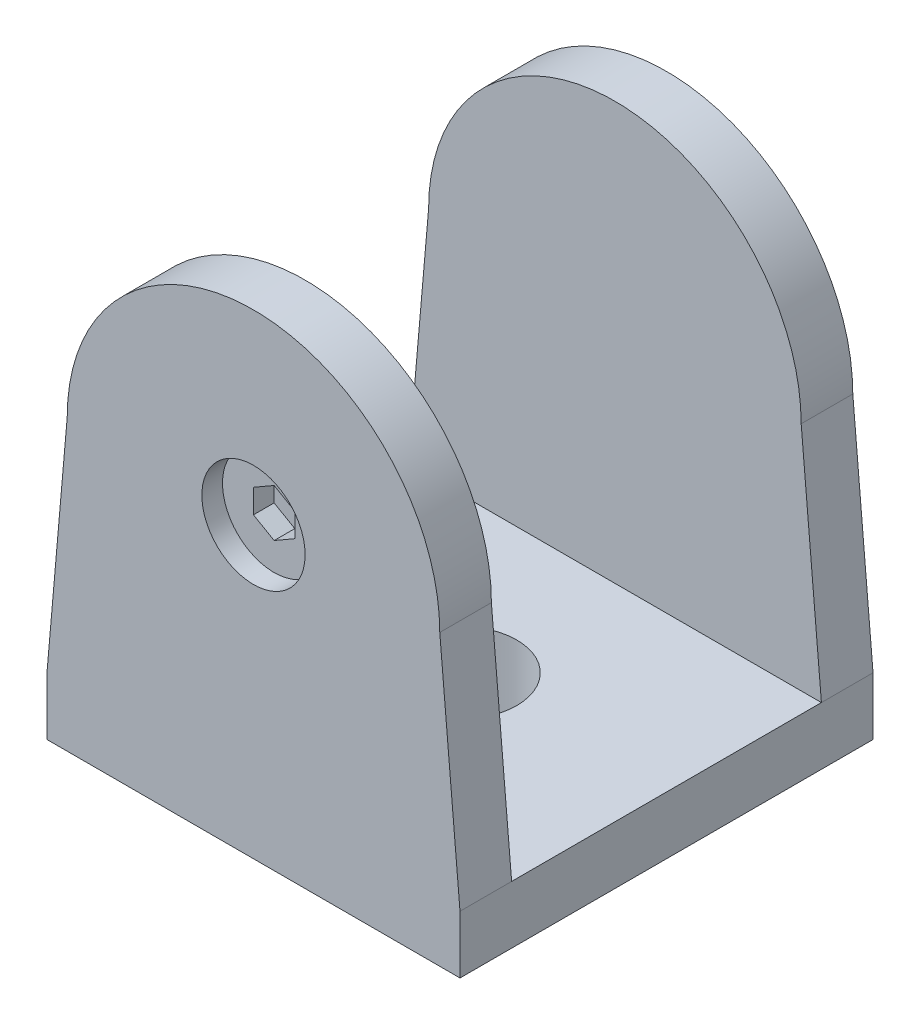
ISO-10303-21;
HEADER;
FILE_DESCRIPTION(('STEP AP214'),'2;1');
FILE_NAME('part.step','',(''),(''),'','','');
FILE_SCHEMA(('AUTOMOTIVE_DESIGN { 1 0 10303 214 1 1 1 1 }'));
ENDSEC;
DATA;
#1=APPLICATION_CONTEXT('core data for automotive mechanical design processes');
#2=APPLICATION_PROTOCOL_DEFINITION('international standard','automotive_design',2000,#1);
#3=PRODUCT_CONTEXT('',#1,'mechanical');
#4=PRODUCT('Part','Part','',(#3));
#5=PRODUCT_RELATED_PRODUCT_CATEGORY('part','',(#4));
#6=PRODUCT_DEFINITION_FORMATION('','',#4);
#7=PRODUCT_DEFINITION_CONTEXT('part definition',#1,'design');
#8=PRODUCT_DEFINITION('design','',#6,#7);
#9=PRODUCT_DEFINITION_SHAPE('','',#8);
#10=(LENGTH_UNIT() NAMED_UNIT(*) SI_UNIT(.MILLI.,.METRE.));
#11=(NAMED_UNIT(*) PLANE_ANGLE_UNIT() SI_UNIT($,.RADIAN.));
#12=(NAMED_UNIT(*) SI_UNIT($,.STERADIAN.) SOLID_ANGLE_UNIT());
#13=UNCERTAINTY_MEASURE_WITH_UNIT(LENGTH_MEASURE(1.E-05),#10,'distance_accuracy_value','');
#14=(GEOMETRIC_REPRESENTATION_CONTEXT(3) GLOBAL_UNCERTAINTY_ASSIGNED_CONTEXT((#13)) GLOBAL_UNIT_ASSIGNED_CONTEXT((#10,
#11,#12)) REPRESENTATION_CONTEXT('',''));
#15=CARTESIAN_POINT('',(0.,0.,0.));
#16=DIRECTION('',(0.,0.,1.));
#17=DIRECTION('',(1.,0.,0.));
#18=AXIS2_PLACEMENT_3D('',#15,#16,#17);
#19=CARTESIAN_POINT('',(0.,0.,10.));
#20=DIRECTION('',(0.,0.,1.));
#21=DIRECTION('',(1.,0.,0.));
#22=AXIS2_PLACEMENT_3D('',#19,#20,#21);
#23=PLANE('',#22);
#24=CARTESIAN_POINT('',(0.,14.,10.));
#25=DIRECTION('',(0.,0.,1.));
#26=DIRECTION('',(1.,0.,0.));
#27=AXIS2_PLACEMENT_3D('',#24,#25,#26);
#28=CIRCLE('',#27,2.5);
#29=CARTESIAN_POINT('',(2.5,14.,10.));
#30=VERTEX_POINT('',#29);
#31=EDGE_CURVE('E376',#30,#30,#28,.T.);
#32=ORIENTED_EDGE('',*,*,#31,.F.);
#33=EDGE_LOOP('',(#32));
#34=FACE_BOUND('',#33,.T.);
#35=DIRECTION('',(0.,1.,0.));
#36=VECTOR('',#35,1.);
#37=CARTESIAN_POINT('',(10.,0.,10.));
#38=LINE('',#37,#36);
#39=CARTESIAN_POINT('',(10.,0.,10.));
#40=VERTEX_POINT('',#39);
#41=CARTESIAN_POINT('',(10.,2.8,10.));
#42=VERTEX_POINT('',#41);
#43=EDGE_CURVE('E11',#40,#42,#38,.T.);
#44=ORIENTED_EDGE('',*,*,#43,.T.);
#45=DIRECTION('',(-0.0871557427476582,0.996194698091746,0.));
#46=VECTOR('',#45,1.);
#47=CARTESIAN_POINT('',(10.,2.8,10.));
#48=LINE('',#47,#46);
#49=CARTESIAN_POINT('',(9.02012696850965,14.,10.));
#50=VERTEX_POINT('',#49);
#51=EDGE_CURVE('E254',#42,#50,#48,.T.);
#52=ORIENTED_EDGE('',*,*,#51,.T.);
#53=CARTESIAN_POINT('',(0.,14.,10.));
#54=DIRECTION('',(0.,0.,1.));
#55=DIRECTION('',(1.,0.,0.));
#56=AXIS2_PLACEMENT_3D('',#53,#54,#55);
#57=CIRCLE('',#56,9.02012696850965);
#58=CARTESIAN_POINT('',(-9.02012696850965,14.,10.));
#59=VERTEX_POINT('',#58);
#60=EDGE_CURVE('E332',#50,#59,#57,.T.);
#61=ORIENTED_EDGE('',*,*,#60,.T.);
#62=DIRECTION('',(-0.0871557427476582,-0.996194698091746,0.));
#63=VECTOR('',#62,1.);
#64=CARTESIAN_POINT('',(-9.02012696850965,14.,10.));
#65=LINE('',#64,#63);
#66=CARTESIAN_POINT('',(-10.,2.8,10.));
#67=VERTEX_POINT('',#66);
#68=EDGE_CURVE('E367',#59,#67,#65,.T.);
#69=ORIENTED_EDGE('',*,*,#68,.T.);
#70=DIRECTION('',(0.,-1.,0.));
#71=VECTOR('',#70,1.);
#72=CARTESIAN_POINT('',(-10.,2.8,10.));
#73=LINE('',#72,#71);
#74=CARTESIAN_POINT('',(-10.,0.,10.));
#75=VERTEX_POINT('',#74);
#76=EDGE_CURVE('E30',#67,#75,#73,.T.);
#77=ORIENTED_EDGE('',*,*,#76,.T.);
#78=DIRECTION('',(1.,0.,0.));
#79=VECTOR('',#78,1.);
#80=CARTESIAN_POINT('',(-10.,0.,10.));
#81=LINE('',#80,#79);
#82=EDGE_CURVE('E428',#75,#40,#81,.T.);
#83=ORIENTED_EDGE('',*,*,#82,.T.);
#84=EDGE_LOOP('',(#44,#52,#61,#69,#77,#83));
#85=FACE_BOUND('',#84,.T.);
#86=ADVANCED_FACE('F19',(#34,#85),#23,.T.);
#87=CARTESIAN_POINT('',(10.,0.,10.));
#88=DIRECTION('',(-1.,0.,0.));
#89=DIRECTION('',(0.,0.,1.));
#90=AXIS2_PLACEMENT_3D('',#87,#88,#89);
#91=PLANE('',#90);
#92=DIRECTION('',(0.,1.,0.));
#93=VECTOR('',#92,1.);
#94=CARTESIAN_POINT('',(10.,0.,-10.));
#95=LINE('',#94,#93);
#96=CARTESIAN_POINT('',(10.,0.,-10.));
#97=VERTEX_POINT('',#96);
#98=CARTESIAN_POINT('',(10.,2.8,-10.));
#99=VERTEX_POINT('',#98);
#100=EDGE_CURVE('E416',#97,#99,#95,.T.);
#101=ORIENTED_EDGE('',*,*,#100,.T.);
#102=DIRECTION('',(0.,0.,-1.));
#103=VECTOR('',#102,1.);
#104=CARTESIAN_POINT('',(10.,2.8,-7.5));
#105=LINE('',#104,#103);
#106=CARTESIAN_POINT('',(10.,2.8,-7.5));
#107=VERTEX_POINT('',#106);
#108=EDGE_CURVE('E291',#107,#99,#105,.T.);
#109=ORIENTED_EDGE('',*,*,#108,.F.);
#110=DIRECTION('',(0.,0.,-1.));
#111=VECTOR('',#110,1.);
#112=CARTESIAN_POINT('',(10.,2.8,10.));
#113=LINE('',#112,#111);
#114=CARTESIAN_POINT('',(10.,2.8,7.5));
#115=VERTEX_POINT('',#114);
#116=EDGE_CURVE('E305',#115,#107,#113,.T.);
#117=ORIENTED_EDGE('',*,*,#116,.F.);
#118=DIRECTION('',(0.,0.,-1.));
#119=VECTOR('',#118,1.);
#120=CARTESIAN_POINT('',(10.,2.8,10.));
#121=LINE('',#120,#119);
#122=EDGE_CURVE('E253',#42,#115,#121,.T.);
#123=ORIENTED_EDGE('',*,*,#122,.F.);
#124=ORIENTED_EDGE('',*,*,#43,.F.);
#125=DIRECTION('',(0.,0.,-1.));
#126=VECTOR('',#125,1.);
#127=CARTESIAN_POINT('',(10.,0.,10.));
#128=LINE('',#127,#126);
#129=EDGE_CURVE('E424',#40,#97,#128,.T.);
#130=ORIENTED_EDGE('',*,*,#129,.T.);
#131=EDGE_LOOP('',(#101,#109,#117,#123,#124,#130));
#132=FACE_BOUND('',#131,.T.);
#133=ADVANCED_FACE('F591',(#132),#91,.F.);
#134=CARTESIAN_POINT('',(-10.,2.8,10.));
#135=DIRECTION('',(1.,0.,0.));
#136=DIRECTION('',(0.,1.,0.));
#137=AXIS2_PLACEMENT_3D('',#134,#135,#136);
#138=PLANE('',#137);
#139=DIRECTION('',(0.,-1.,0.));
#140=VECTOR('',#139,1.);
#141=CARTESIAN_POINT('',(-10.,2.8,-10.));
#142=LINE('',#141,#140);
#143=CARTESIAN_POINT('',(-10.,2.8,-10.));
#144=VERTEX_POINT('',#143);
#145=CARTESIAN_POINT('',(-10.,0.,-10.));
#146=VERTEX_POINT('',#145);
#147=EDGE_CURVE('E454',#144,#146,#142,.T.);
#148=ORIENTED_EDGE('',*,*,#147,.T.);
#149=DIRECTION('',(0.,0.,-1.));
#150=VECTOR('',#149,1.);
#151=CARTESIAN_POINT('',(-10.,0.,10.));
#152=LINE('',#151,#150);
#153=EDGE_CURVE('E341',#75,#146,#152,.T.);
#154=ORIENTED_EDGE('',*,*,#153,.F.);
#155=ORIENTED_EDGE('',*,*,#76,.F.);
#156=DIRECTION('',(0.,0.,-1.));
#157=VECTOR('',#156,1.);
#158=CARTESIAN_POINT('',(-10.,2.8,10.));
#159=LINE('',#158,#157);
#160=CARTESIAN_POINT('',(-10.,2.8,7.5));
#161=VERTEX_POINT('',#160);
#162=EDGE_CURVE('E258',#67,#161,#159,.T.);
#163=ORIENTED_EDGE('',*,*,#162,.T.);
#164=DIRECTION('',(0.,0.,-1.));
#165=VECTOR('',#164,1.);
#166=CARTESIAN_POINT('',(-10.,2.8,10.));
#167=LINE('',#166,#165);
#168=CARTESIAN_POINT('',(-10.,2.8,-7.5));
#169=VERTEX_POINT('',#168);
#170=EDGE_CURVE('E411',#161,#169,#167,.T.);
#171=ORIENTED_EDGE('',*,*,#170,.T.);
#172=DIRECTION('',(0.,0.,-1.));
#173=VECTOR('',#172,1.);
#174=CARTESIAN_POINT('',(-10.,2.8,-7.5));
#175=LINE('',#174,#173);
#176=EDGE_CURVE('E297',#169,#144,#175,.T.);
#177=ORIENTED_EDGE('',*,*,#176,.T.);
#178=EDGE_LOOP('',(#148,#154,#155,#163,#171,#177));
#179=FACE_BOUND('',#178,.T.);
#180=ADVANCED_FACE('F673',(#179),#138,.F.);
#181=CARTESIAN_POINT('',(10.,2.8,10.));
#182=DIRECTION('',(0.,-1.,0.));
#183=DIRECTION('',(0.,0.,-1.));
#184=AXIS2_PLACEMENT_3D('',#181,#182,#183);
#185=PLANE('',#184);
#186=CARTESIAN_POINT('',(0.,2.8,0.));
#187=DIRECTION('',(0.,1.,0.));
#188=DIRECTION('',(1.,0.,0.));
#189=AXIS2_PLACEMENT_3D('',#186,#187,#188);
#190=CIRCLE('',#189,2.75);
#191=CARTESIAN_POINT('',(2.75,2.8,0.));
#192=VERTEX_POINT('',#191);
#193=EDGE_CURVE('E42',#192,#192,#190,.T.);
#194=ORIENTED_EDGE('',*,*,#193,.F.);
#195=EDGE_LOOP('',(#194));
#196=FACE_BOUND('',#195,.T.);
#197=ORIENTED_EDGE('',*,*,#116,.T.);
#198=DIRECTION('',(1.,0.,0.));
#199=VECTOR('',#198,1.);
#200=CARTESIAN_POINT('',(-10.,2.8,-7.5));
#201=LINE('',#200,#199);
#202=EDGE_CURVE('E440',#169,#107,#201,.T.);
#203=ORIENTED_EDGE('',*,*,#202,.F.);
#204=ORIENTED_EDGE('',*,*,#170,.F.);
#205=DIRECTION('',(1.,0.,0.));
#206=VECTOR('',#205,1.);
#207=CARTESIAN_POINT('',(-10.,2.8,7.5));
#208=LINE('',#207,#206);
#209=EDGE_CURVE('E296',#161,#115,#208,.T.);
#210=ORIENTED_EDGE('',*,*,#209,.T.);
#211=EDGE_LOOP('',(#197,#203,#204,#210));
#212=FACE_BOUND('',#211,.T.);
#213=ADVANCED_FACE('F666',(#196,#212),#185,.F.);
#214=CARTESIAN_POINT('',(0.,2.8,0.));
#215=DIRECTION('',(0.,1.,0.));
#216=DIRECTION('',(0.,0.,-1.));
#217=AXIS2_PLACEMENT_3D('',#214,#215,#216);
#218=CYLINDRICAL_SURFACE('',#217,2.75);
#219=ORIENTED_EDGE('',*,*,#193,.T.);
#220=EDGE_LOOP('',(#219));
#221=FACE_BOUND('',#220,.T.);
#222=CARTESIAN_POINT('',(0.,-1.25,0.));
#223=DIRECTION('',(0.,-1.,0.));
#224=DIRECTION('',(0.,0.,1.));
#225=AXIS2_PLACEMENT_3D('',#222,#223,#224);
#226=CIRCLE('',#225,2.75);
#227=CARTESIAN_POINT('',(0.,-1.25,2.75));
#228=VERTEX_POINT('',#227);
#229=EDGE_CURVE('E298',#228,#228,#226,.T.);
#230=ORIENTED_EDGE('',*,*,#229,.T.);
#231=EDGE_LOOP('',(#230));
#232=FACE_BOUND('',#231,.T.);
#233=ADVANCED_FACE('F728',(#221,#232),#218,.F.);
#234=CARTESIAN_POINT('',(0.,-1.25,0.));
#235=DIRECTION('',(0.,1.,0.));
#236=DIRECTION('',(1.,0.,0.));
#237=AXIS2_PLACEMENT_3D('',#234,#235,#236);
#238=PLANE('',#237);
#239=ORIENTED_EDGE('',*,*,#229,.F.);
#240=EDGE_LOOP('',(#239));
#241=FACE_BOUND('',#240,.T.);
#242=DIRECTION('',(0.,0.,1.));
#243=VECTOR('',#242,1.);
#244=CARTESIAN_POINT('',(-3.025,-1.25,-3.025));
#245=LINE('',#244,#243);
#246=CARTESIAN_POINT('',(-3.025,-1.25,-3.025));
#247=VERTEX_POINT('',#246);
#248=CARTESIAN_POINT('',(-3.025,-1.25,3.025));
#249=VERTEX_POINT('',#248);
#250=EDGE_CURVE('E335',#247,#249,#245,.T.);
#251=ORIENTED_EDGE('',*,*,#250,.F.);
#252=DIRECTION('',(-1.,0.,0.));
#253=VECTOR('',#252,1.);
#254=CARTESIAN_POINT('',(3.025,-1.25,-3.025));
#255=LINE('',#254,#253);
#256=CARTESIAN_POINT('',(3.025,-1.25,-3.025));
#257=VERTEX_POINT('',#256);
#258=EDGE_CURVE('E286',#257,#247,#255,.T.);
#259=ORIENTED_EDGE('',*,*,#258,.F.);
#260=DIRECTION('',(0.,0.,-1.));
#261=VECTOR('',#260,1.);
#262=CARTESIAN_POINT('',(3.025,-1.25,3.025));
#263=LINE('',#262,#261);
#264=CARTESIAN_POINT('',(3.025,-1.25,3.025));
#265=VERTEX_POINT('',#264);
#266=EDGE_CURVE('E287',#265,#257,#263,.T.);
#267=ORIENTED_EDGE('',*,*,#266,.F.);
#268=DIRECTION('',(1.,0.,0.));
#269=VECTOR('',#268,1.);
#270=CARTESIAN_POINT('',(-3.025,-1.25,3.025));
#271=LINE('',#270,#269);
#272=EDGE_CURVE('E408',#249,#265,#271,.T.);
#273=ORIENTED_EDGE('',*,*,#272,.F.);
#274=EDGE_LOOP('',(#251,#259,#267,#273));
#275=FACE_BOUND('',#274,.T.);
#276=ADVANCED_FACE('F724',(#241,#275),#238,.F.);
#277=CARTESIAN_POINT('',(3.025,1.25,-3.025));
#278=DIRECTION('',(0.,0.,1.));
#279=DIRECTION('',(1.,0.,0.));
#280=AXIS2_PLACEMENT_3D('',#277,#278,#279);
#281=PLANE('',#280);
#282=ORIENTED_EDGE('',*,*,#258,.T.);
#283=DIRECTION('',(0.,-1.,0.));
#284=VECTOR('',#283,1.);
#285=CARTESIAN_POINT('',(-3.025,1.25,-3.025));
#286=LINE('',#285,#284);
#287=CARTESIAN_POINT('',(-3.025,1.25,-3.025));
#288=VERTEX_POINT('',#287);
#289=EDGE_CURVE('E405',#288,#247,#286,.T.);
#290=ORIENTED_EDGE('',*,*,#289,.F.);
#291=DIRECTION('',(-1.,0.,0.));
#292=VECTOR('',#291,1.);
#293=CARTESIAN_POINT('',(3.025,1.25,-3.025));
#294=LINE('',#293,#292);
#295=CARTESIAN_POINT('',(3.025,1.25,-3.025));
#296=VERTEX_POINT('',#295);
#297=EDGE_CURVE('E429',#296,#288,#294,.T.);
#298=ORIENTED_EDGE('',*,*,#297,.F.);
#299=DIRECTION('',(0.,-1.,0.));
#300=VECTOR('',#299,1.);
#301=CARTESIAN_POINT('',(3.025,1.25,-3.025));
#302=LINE('',#301,#300);
#303=EDGE_CURVE('E282',#296,#257,#302,.T.);
#304=ORIENTED_EDGE('',*,*,#303,.T.);
#305=EDGE_LOOP('',(#282,#290,#298,#304));
#306=FACE_BOUND('',#305,.T.);
#307=ADVANCED_FACE('F727',(#306),#281,.F.);
#308=CARTESIAN_POINT('',(3.025,1.25,3.025));
#309=DIRECTION('',(-1.,0.,0.));
#310=DIRECTION('',(0.,0.,1.));
#311=AXIS2_PLACEMENT_3D('',#308,#309,#310);
#312=PLANE('',#311);
#313=ORIENTED_EDGE('',*,*,#266,.T.);
#314=ORIENTED_EDGE('',*,*,#303,.F.);
#315=DIRECTION('',(0.,0.,-1.));
#316=VECTOR('',#315,1.);
#317=CARTESIAN_POINT('',(3.025,1.25,3.025));
#318=LINE('',#317,#316);
#319=CARTESIAN_POINT('',(3.025,1.25,3.025));
#320=VERTEX_POINT('',#319);
#321=EDGE_CURVE('E487',#320,#296,#318,.T.);
#322=ORIENTED_EDGE('',*,*,#321,.F.);
#323=DIRECTION('',(0.,-1.,0.));
#324=VECTOR('',#323,1.);
#325=CARTESIAN_POINT('',(3.025,1.25,3.025));
#326=LINE('',#325,#324);
#327=EDGE_CURVE('E397',#320,#265,#326,.T.);
#328=ORIENTED_EDGE('',*,*,#327,.T.);
#329=EDGE_LOOP('',(#313,#314,#322,#328));
#330=FACE_BOUND('',#329,.T.);
#331=ADVANCED_FACE('F789',(#330),#312,.F.);
#332=CARTESIAN_POINT('',(-3.025,1.25,3.025));
#333=DIRECTION('',(0.,0.,-1.));
#334=DIRECTION('',(0.,-1.,0.));
#335=AXIS2_PLACEMENT_3D('',#332,#333,#334);
#336=PLANE('',#335);
#337=ORIENTED_EDGE('',*,*,#272,.T.);
#338=ORIENTED_EDGE('',*,*,#327,.F.);
#339=DIRECTION('',(1.,0.,0.));
#340=VECTOR('',#339,1.);
#341=CARTESIAN_POINT('',(-3.025,1.25,3.025));
#342=LINE('',#341,#340);
#343=CARTESIAN_POINT('',(-3.025,1.25,3.025));
#344=VERTEX_POINT('',#343);
#345=EDGE_CURVE('E483',#344,#320,#342,.T.);
#346=ORIENTED_EDGE('',*,*,#345,.F.);
#347=DIRECTION('',(0.,-1.,0.));
#348=VECTOR('',#347,1.);
#349=CARTESIAN_POINT('',(-3.025,1.25,3.025));
#350=LINE('',#349,#348);
#351=EDGE_CURVE('E393',#344,#249,#350,.T.);
#352=ORIENTED_EDGE('',*,*,#351,.T.);
#353=EDGE_LOOP('',(#337,#338,#346,#352));
#354=FACE_BOUND('',#353,.T.);
#355=ADVANCED_FACE('F780',(#354),#336,.F.);
#356=CARTESIAN_POINT('',(-3.025,1.25,-3.025));
#357=DIRECTION('',(1.,0.,0.));
#358=DIRECTION('',(0.,1.,0.));
#359=AXIS2_PLACEMENT_3D('',#356,#357,#358);
#360=PLANE('',#359);
#361=ORIENTED_EDGE('',*,*,#250,.T.);
#362=ORIENTED_EDGE('',*,*,#351,.F.);
#363=DIRECTION('',(0.,0.,1.));
#364=VECTOR('',#363,1.);
#365=CARTESIAN_POINT('',(-3.025,1.25,-3.025));
#366=LINE('',#365,#364);
#367=EDGE_CURVE('E275',#288,#344,#366,.T.);
#368=ORIENTED_EDGE('',*,*,#367,.F.);
#369=ORIENTED_EDGE('',*,*,#289,.T.);
#370=EDGE_LOOP('',(#361,#362,#368,#369));
#371=FACE_BOUND('',#370,.T.);
#372=ADVANCED_FACE('F777',(#371),#360,.F.);
#373=CARTESIAN_POINT('',(0.,14.,7.5));
#374=DIRECTION('',(0.,0.,-1.));
#375=DIRECTION('',(1.,0.,0.));
#376=AXIS2_PLACEMENT_3D('',#373,#374,#375);
#377=CYLINDRICAL_SURFACE('',#376,9.02012696850965);
#378=ORIENTED_EDGE('',*,*,#60,.F.);
#379=DIRECTION('',(0.,0.,1.));
#380=VECTOR('',#379,1.);
#381=CARTESIAN_POINT('',(9.02012696850965,14.,7.5));
#382=LINE('',#381,#380);
#383=CARTESIAN_POINT('',(9.02012696850965,14.,7.5));
#384=VERTEX_POINT('',#383);
#385=EDGE_CURVE('E252',#384,#50,#382,.T.);
#386=ORIENTED_EDGE('',*,*,#385,.F.);
#387=CARTESIAN_POINT('',(0.,14.,7.5));
#388=DIRECTION('',(0.,0.,1.));
#389=DIRECTION('',(1.,0.,0.));
#390=AXIS2_PLACEMENT_3D('',#387,#388,#389);
#391=CIRCLE('',#390,9.02012696850965);
#392=CARTESIAN_POINT('',(-9.02012696850965,14.,7.5));
#393=VERTEX_POINT('',#392);
#394=EDGE_CURVE('E294',#384,#393,#391,.T.);
#395=ORIENTED_EDGE('',*,*,#394,.T.);
#396=DIRECTION('',(0.,0.,1.));
#397=VECTOR('',#396,1.);
#398=CARTESIAN_POINT('',(-9.02012696850965,14.,7.5));
#399=LINE('',#398,#397);
#400=EDGE_CURVE('E362',#393,#59,#399,.T.);
#401=ORIENTED_EDGE('',*,*,#400,.T.);
#402=EDGE_LOOP('',(#378,#386,#395,#401));
#403=FACE_BOUND('',#402,.T.);
#404=ADVANCED_FACE('F658',(#403),#377,.T.);
#405=CARTESIAN_POINT('',(0.,14.,7.5));
#406=DIRECTION('',(0.,0.,1.));
#407=DIRECTION('',(1.,0.,0.));
#408=AXIS2_PLACEMENT_3D('',#405,#406,#407);
#409=PLANE('',#408);
#410=DIRECTION('',(-0.0871557427476582,-0.996194698091746,0.));
#411=VECTOR('',#410,1.);
#412=CARTESIAN_POINT('',(-9.02012696850965,14.,7.5));
#413=LINE('',#412,#411);
#414=EDGE_CURVE('E366',#393,#161,#413,.T.);
#415=ORIENTED_EDGE('',*,*,#414,.F.);
#416=ORIENTED_EDGE('',*,*,#394,.F.);
#417=DIRECTION('',(-0.0871557427476582,0.996194698091746,0.));
#418=VECTOR('',#417,1.);
#419=CARTESIAN_POINT('',(10.,2.8,7.5));
#420=LINE('',#419,#418);
#421=EDGE_CURVE('E249',#115,#384,#420,.T.);
#422=ORIENTED_EDGE('',*,*,#421,.F.);
#423=ORIENTED_EDGE('',*,*,#209,.F.);
#424=EDGE_LOOP('',(#415,#416,#422,#423));
#425=FACE_BOUND('',#424,.T.);
#426=ADVANCED_FACE('F654',(#425),#409,.F.);
#427=CARTESIAN_POINT('',(-9.02012696850965,14.,-7.5));
#428=DIRECTION('',(0.996194698091746,-0.0871557427476582,0.));
#429=DIRECTION('',(0.,0.,-1.));
#430=AXIS2_PLACEMENT_3D('',#427,#428,#429);
#431=PLANE('',#430);
#432=DIRECTION('',(-0.0871557427476582,-0.996194698091746,0.));
#433=VECTOR('',#432,1.);
#434=CARTESIAN_POINT('',(-9.02012696850965,14.,-10.));
#435=LINE('',#434,#433);
#436=CARTESIAN_POINT('',(-9.02012696850965,14.,-10.));
#437=VERTEX_POINT('',#436);
#438=EDGE_CURVE('E389',#437,#144,#435,.T.);
#439=ORIENTED_EDGE('',*,*,#438,.T.);
#440=ORIENTED_EDGE('',*,*,#176,.F.);
#441=DIRECTION('',(-0.0871557427476582,-0.996194698091746,0.));
#442=VECTOR('',#441,1.);
#443=CARTESIAN_POINT('',(-9.02012696850965,14.,-7.5));
#444=LINE('',#443,#442);
#445=CARTESIAN_POINT('',(-9.02012696850965,14.,-7.5));
#446=VERTEX_POINT('',#445);
#447=EDGE_CURVE('E498',#446,#169,#444,.T.);
#448=ORIENTED_EDGE('',*,*,#447,.F.);
#449=DIRECTION('',(0.,0.,-1.));
#450=VECTOR('',#449,1.);
#451=CARTESIAN_POINT('',(-9.02012696850965,14.,-7.5));
#452=LINE('',#451,#450);
#453=EDGE_CURVE('E292',#446,#437,#452,.T.);
#454=ORIENTED_EDGE('',*,*,#453,.T.);
#455=EDGE_LOOP('',(#439,#440,#448,#454));
#456=FACE_BOUND('',#455,.T.);
#457=ADVANCED_FACE('F743',(#456),#431,.F.);
#458=CARTESIAN_POINT('',(10.,2.8,-7.5));
#459=DIRECTION('',(-0.996194698091746,-0.0871557427476582,0.));
#460=DIRECTION('',(-0.0871557427476582,0.996194698091746,0.));
#461=AXIS2_PLACEMENT_3D('',#458,#459,#460);
#462=PLANE('',#461);
#463=DIRECTION('',(-0.0871557427476582,0.996194698091746,0.));
#464=VECTOR('',#463,1.);
#465=CARTESIAN_POINT('',(10.,2.8,-10.));
#466=LINE('',#465,#464);
#467=CARTESIAN_POINT('',(9.02012696850965,14.,-10.));
#468=VERTEX_POINT('',#467);
#469=EDGE_CURVE('E388',#99,#468,#466,.T.);
#470=ORIENTED_EDGE('',*,*,#469,.T.);
#471=DIRECTION('',(0.,0.,-1.));
#472=VECTOR('',#471,1.);
#473=CARTESIAN_POINT('',(9.02012696850965,14.,-7.5));
#474=LINE('',#473,#472);
#475=CARTESIAN_POINT('',(9.02012696850965,14.,-7.5));
#476=VERTEX_POINT('',#475);
#477=EDGE_CURVE('E288',#476,#468,#474,.T.);
#478=ORIENTED_EDGE('',*,*,#477,.F.);
#479=DIRECTION('',(-0.0871557427476582,0.996194698091746,0.));
#480=VECTOR('',#479,1.);
#481=CARTESIAN_POINT('',(10.,2.8,-7.5));
#482=LINE('',#481,#480);
#483=EDGE_CURVE('E435',#107,#476,#482,.T.);
#484=ORIENTED_EDGE('',*,*,#483,.F.);
#485=ORIENTED_EDGE('',*,*,#108,.T.);
#486=EDGE_LOOP('',(#470,#478,#484,#485));
#487=FACE_BOUND('',#486,.T.);
#488=ADVANCED_FACE('F585',(#487),#462,.F.);
#489=CARTESIAN_POINT('',(0.,14.,-7.5));
#490=DIRECTION('',(0.,0.,1.));
#491=DIRECTION('',(-1.,0.,0.));
#492=AXIS2_PLACEMENT_3D('',#489,#490,#491);
#493=CYLINDRICAL_SURFACE('',#492,9.02012696850965);
#494=CARTESIAN_POINT('',(0.,14.,-10.));
#495=DIRECTION('',(0.,0.,1.));
#496=DIRECTION('',(1.,0.,0.));
#497=AXIS2_PLACEMENT_3D('',#494,#495,#496);
#498=CIRCLE('',#497,9.02012696850965);
#499=EDGE_CURVE('E384',#468,#437,#498,.T.);
#500=ORIENTED_EDGE('',*,*,#499,.T.);
#501=ORIENTED_EDGE('',*,*,#453,.F.);
#502=CARTESIAN_POINT('',(0.,14.,-7.5));
#503=DIRECTION('',(0.,0.,1.));
#504=DIRECTION('',(1.,0.,0.));
#505=AXIS2_PLACEMENT_3D('',#502,#503,#504);
#506=CIRCLE('',#505,9.02012696850965);
#507=EDGE_CURVE('E439',#476,#446,#506,.T.);
#508=ORIENTED_EDGE('',*,*,#507,.F.);
#509=ORIENTED_EDGE('',*,*,#477,.T.);
#510=EDGE_LOOP('',(#500,#501,#508,#509));
#511=FACE_BOUND('',#510,.T.);
#512=ADVANCED_FACE('F602',(#511),#493,.T.);
#513=CARTESIAN_POINT('',(0.,14.,-7.5));
#514=DIRECTION('',(0.,0.,1.));
#515=DIRECTION('',(1.,0.,0.));
#516=AXIS2_PLACEMENT_3D('',#513,#514,#515);
#517=PLANE('',#516);
#518=ORIENTED_EDGE('',*,*,#447,.T.);
#519=ORIENTED_EDGE('',*,*,#202,.T.);
#520=ORIENTED_EDGE('',*,*,#483,.T.);
#521=ORIENTED_EDGE('',*,*,#507,.T.);
#522=EDGE_LOOP('',(#518,#519,#520,#521));
#523=FACE_BOUND('',#522,.T.);
#524=ADVANCED_FACE('F784',(#523),#517,.T.);
#525=CARTESIAN_POINT('',(0.,14.,9.));
#526=DIRECTION('',(0.,0.,-1.));
#527=DIRECTION('',(1.,0.,0.));
#528=AXIS2_PLACEMENT_3D('',#525,#526,#527);
#529=CYLINDRICAL_SURFACE('',#528,2.5);
#530=CARTESIAN_POINT('',(0.,14.,9.));
#531=DIRECTION('',(0.,0.,1.));
#532=DIRECTION('',(1.,0.,0.));
#533=AXIS2_PLACEMENT_3D('',#530,#531,#532);
#534=CIRCLE('',#533,2.5);
#535=CARTESIAN_POINT('',(2.5,14.,9.));
#536=VERTEX_POINT('',#535);
#537=EDGE_CURVE('E373',#536,#536,#534,.T.);
#538=ORIENTED_EDGE('',*,*,#537,.F.);
#539=EDGE_LOOP('',(#538));
#540=FACE_BOUND('',#539,.T.);
#541=ORIENTED_EDGE('',*,*,#31,.T.);
#542=EDGE_LOOP('',(#541));
#543=FACE_BOUND('',#542,.T.);
#544=ADVANCED_FACE('F721',(#540,#543),#529,.F.);
#545=CARTESIAN_POINT('',(0.,14.,9.));
#546=DIRECTION('',(0.,0.,1.));
#547=DIRECTION('',(1.,0.,0.));
#548=AXIS2_PLACEMENT_3D('',#545,#546,#547);
#549=PLANE('',#548);
#550=DIRECTION('',(0.,-1.,0.));
#551=VECTOR('',#550,1.);
#552=CARTESIAN_POINT('',(-1.,14.5773502691896,9.));
#553=LINE('',#552,#551);
#554=CARTESIAN_POINT('',(-1.,14.5773502691896,9.));
#555=VERTEX_POINT('',#554);
#556=CARTESIAN_POINT('',(-1.,13.4226497308104,9.));
#557=VERTEX_POINT('',#556);
#558=EDGE_CURVE('E377',#555,#557,#553,.T.);
#559=ORIENTED_EDGE('',*,*,#558,.F.);
#560=DIRECTION('',(-0.866025403784439,-0.5,0.));
#561=VECTOR('',#560,1.);
#562=CARTESIAN_POINT('',(0.,15.1547005383793,9.));
#563=LINE('',#562,#561);
#564=CARTESIAN_POINT('',(0.,15.1547005383793,9.));
#565=VERTEX_POINT('',#564);
#566=EDGE_CURVE('E235',#565,#555,#563,.T.);
#567=ORIENTED_EDGE('',*,*,#566,.F.);
#568=DIRECTION('',(-0.866025403784439,0.5,0.));
#569=VECTOR('',#568,1.);
#570=CARTESIAN_POINT('',(1.,14.5773502691896,9.));
#571=LINE('',#570,#569);
#572=CARTESIAN_POINT('',(1.,14.5773502691896,9.));
#573=VERTEX_POINT('',#572);
#574=EDGE_CURVE('E224',#573,#565,#571,.T.);
#575=ORIENTED_EDGE('',*,*,#574,.F.);
#576=DIRECTION('',(0.,1.,0.));
#577=VECTOR('',#576,1.);
#578=CARTESIAN_POINT('',(1.,13.4226497308104,9.));
#579=LINE('',#578,#577);
#580=CARTESIAN_POINT('',(1.,13.4226497308104,9.));
#581=VERTEX_POINT('',#580);
#582=EDGE_CURVE('E209',#581,#573,#579,.T.);
#583=ORIENTED_EDGE('',*,*,#582,.F.);
#584=DIRECTION('',(0.866025403784439,0.5,0.));
#585=VECTOR('',#584,1.);
#586=CARTESIAN_POINT('',(0.,12.8452994616207,9.));
#587=LINE('',#586,#585);
#588=CARTESIAN_POINT('',(0.,12.8452994616207,9.));
#589=VERTEX_POINT('',#588);
#590=EDGE_CURVE('E322',#589,#581,#587,.T.);
#591=ORIENTED_EDGE('',*,*,#590,.F.);
#592=DIRECTION('',(0.866025403784439,-0.5,0.));
#593=VECTOR('',#592,1.);
#594=CARTESIAN_POINT('',(-1.,13.4226497308104,9.));
#595=LINE('',#594,#593);
#596=EDGE_CURVE('E353',#557,#589,#595,.T.);
#597=ORIENTED_EDGE('',*,*,#596,.F.);
#598=EDGE_LOOP('',(#559,#567,#575,#583,#591,#597));
#599=FACE_BOUND('',#598,.T.);
#600=ORIENTED_EDGE('',*,*,#537,.T.);
#601=EDGE_LOOP('',(#600));
#602=FACE_BOUND('',#601,.T.);
#603=ADVANCED_FACE('F232',(#599,#602),#549,.T.);
#604=CARTESIAN_POINT('',(-1.,14.5773502691896,8.));
#605=DIRECTION('',(-1.,0.,0.));
#606=DIRECTION('',(0.,0.,1.));
#607=AXIS2_PLACEMENT_3D('',#604,#605,#606);
#608=PLANE('',#607);
#609=ORIENTED_EDGE('',*,*,#558,.T.);
#610=DIRECTION('',(0.,0.,1.));
#611=VECTOR('',#610,1.);
#612=CARTESIAN_POINT('',(-1.,13.4226497308104,8.));
#613=LINE('',#612,#611);
#614=CARTESIAN_POINT('',(-1.,13.4226497308104,8.));
#615=VERTEX_POINT('',#614);
#616=EDGE_CURVE('E492',#615,#557,#613,.T.);
#617=ORIENTED_EDGE('',*,*,#616,.F.);
#618=DIRECTION('',(0.,-1.,0.));
#619=VECTOR('',#618,1.);
#620=CARTESIAN_POINT('',(-1.,14.5773502691896,8.));
#621=LINE('',#620,#619);
#622=CARTESIAN_POINT('',(-1.,14.5773502691896,8.));
#623=VERTEX_POINT('',#622);
#624=EDGE_CURVE('E349',#623,#615,#621,.T.);
#625=ORIENTED_EDGE('',*,*,#624,.F.);
#626=DIRECTION('',(0.,0.,1.));
#627=VECTOR('',#626,1.);
#628=CARTESIAN_POINT('',(-1.,14.5773502691896,8.));
#629=LINE('',#628,#627);
#630=EDGE_CURVE('E243',#623,#555,#629,.T.);
#631=ORIENTED_EDGE('',*,*,#630,.T.);
#632=EDGE_LOOP('',(#609,#617,#625,#631));
#633=FACE_BOUND('',#632,.T.);
#634=ADVANCED_FACE('F720',(#633),#608,.F.);
#635=CARTESIAN_POINT('',(-1.,13.4226497308104,8.));
#636=DIRECTION('',(-0.5,-0.866025403784439,0.));
#637=DIRECTION('',(-0.866025403784439,0.5,0.));
#638=AXIS2_PLACEMENT_3D('',#635,#636,#637);
#639=PLANE('',#638);
#640=ORIENTED_EDGE('',*,*,#596,.T.);
#641=DIRECTION('',(0.,0.,1.));
#642=VECTOR('',#641,1.);
#643=CARTESIAN_POINT('',(0.,12.8452994616207,8.));
#644=LINE('',#643,#642);
#645=CARTESIAN_POINT('',(0.,12.8452994616207,8.));
#646=VERTEX_POINT('',#645);
#647=EDGE_CURVE('E324',#646,#589,#644,.T.);
#648=ORIENTED_EDGE('',*,*,#647,.F.);
#649=DIRECTION('',(0.866025403784439,-0.5,0.));
#650=VECTOR('',#649,1.);
#651=CARTESIAN_POINT('',(-1.,13.4226497308104,8.));
#652=LINE('',#651,#650);
#653=EDGE_CURVE('E344',#615,#646,#652,.T.);
#654=ORIENTED_EDGE('',*,*,#653,.F.);
#655=ORIENTED_EDGE('',*,*,#616,.T.);
#656=EDGE_LOOP('',(#640,#648,#654,#655));
#657=FACE_BOUND('',#656,.T.);
#658=ADVANCED_FACE('F710',(#657),#639,.F.);
#659=CARTESIAN_POINT('',(0.,12.8452994616207,8.));
#660=DIRECTION('',(0.5,-0.866025403784439,0.));
#661=DIRECTION('',(0.,0.,-1.));
#662=AXIS2_PLACEMENT_3D('',#659,#660,#661);
#663=PLANE('',#662);
#664=ORIENTED_EDGE('',*,*,#590,.T.);
#665=DIRECTION('',(0.,0.,1.));
#666=VECTOR('',#665,1.);
#667=CARTESIAN_POINT('',(1.,13.4226497308104,8.));
#668=LINE('',#667,#666);
#669=CARTESIAN_POINT('',(1.,13.4226497308104,8.));
#670=VERTEX_POINT('',#669);
#671=EDGE_CURVE('E216',#670,#581,#668,.T.);
#672=ORIENTED_EDGE('',*,*,#671,.F.);
#673=DIRECTION('',(0.866025403784439,0.5,0.));
#674=VECTOR('',#673,1.);
#675=CARTESIAN_POINT('',(0.,12.8452994616207,8.));
#676=LINE('',#675,#674);
#677=EDGE_CURVE('E348',#646,#670,#676,.T.);
#678=ORIENTED_EDGE('',*,*,#677,.F.);
#679=ORIENTED_EDGE('',*,*,#647,.T.);
#680=EDGE_LOOP('',(#664,#672,#678,#679));
#681=FACE_BOUND('',#680,.T.);
#682=ADVANCED_FACE('F707',(#681),#663,.F.);
#683=CARTESIAN_POINT('',(1.,13.4226497308104,8.));
#684=DIRECTION('',(1.,0.,0.));
#685=DIRECTION('',(0.,1.,0.));
#686=AXIS2_PLACEMENT_3D('',#683,#684,#685);
#687=PLANE('',#686);
#688=ORIENTED_EDGE('',*,*,#582,.T.);
#689=DIRECTION('',(0.,0.,1.));
#690=VECTOR('',#689,1.);
#691=CARTESIAN_POINT('',(1.,14.5773502691896,8.));
#692=LINE('',#691,#690);
#693=CARTESIAN_POINT('',(1.,14.5773502691896,8.));
#694=VERTEX_POINT('',#693);
#695=EDGE_CURVE('E213',#694,#573,#692,.T.);
#696=ORIENTED_EDGE('',*,*,#695,.F.);
#697=DIRECTION('',(0.,1.,0.));
#698=VECTOR('',#697,1.);
#699=CARTESIAN_POINT('',(1.,13.4226497308104,8.));
#700=LINE('',#699,#698);
#701=EDGE_CURVE('E23',#670,#694,#700,.T.);
#702=ORIENTED_EDGE('',*,*,#701,.F.);
#703=ORIENTED_EDGE('',*,*,#671,.T.);
#704=EDGE_LOOP('',(#688,#696,#702,#703));
#705=FACE_BOUND('',#704,.T.);
#706=ADVANCED_FACE('F211',(#705),#687,.F.);
#707=CARTESIAN_POINT('',(1.,14.5773502691896,8.));
#708=DIRECTION('',(0.5,0.866025403784439,0.));
#709=DIRECTION('',(0.,0.,-1.));
#710=AXIS2_PLACEMENT_3D('',#707,#708,#709);
#711=PLANE('',#710);
#712=ORIENTED_EDGE('',*,*,#574,.T.);
#713=DIRECTION('',(0.,0.,1.));
#714=VECTOR('',#713,1.);
#715=CARTESIAN_POINT('',(0.,15.1547005383793,8.));
#716=LINE('',#715,#714);
#717=CARTESIAN_POINT('',(0.,15.1547005383793,8.));
#718=VERTEX_POINT('',#717);
#719=EDGE_CURVE('E237',#718,#565,#716,.T.);
#720=ORIENTED_EDGE('',*,*,#719,.F.);
#721=DIRECTION('',(-0.866025403784439,0.5,0.));
#722=VECTOR('',#721,1.);
#723=CARTESIAN_POINT('',(1.,14.5773502691896,8.));
#724=LINE('',#723,#722);
#725=EDGE_CURVE('E227',#694,#718,#724,.T.);
#726=ORIENTED_EDGE('',*,*,#725,.F.);
#727=ORIENTED_EDGE('',*,*,#695,.T.);
#728=EDGE_LOOP('',(#712,#720,#726,#727));
#729=FACE_BOUND('',#728,.T.);
#730=ADVANCED_FACE('F223',(#729),#711,.F.);
#731=CARTESIAN_POINT('',(0.,15.1547005383793,8.));
#732=DIRECTION('',(-0.5,0.866025403784439,0.));
#733=DIRECTION('',(0.,0.,1.));
#734=AXIS2_PLACEMENT_3D('',#731,#732,#733);
#735=PLANE('',#734);
#736=ORIENTED_EDGE('',*,*,#566,.T.);
#737=ORIENTED_EDGE('',*,*,#630,.F.);
#738=DIRECTION('',(-0.866025403784439,-0.5,0.));
#739=VECTOR('',#738,1.);
#740=CARTESIAN_POINT('',(0.,15.1547005383793,8.));
#741=LINE('',#740,#739);
#742=EDGE_CURVE('E432',#718,#623,#741,.T.);
#743=ORIENTED_EDGE('',*,*,#742,.F.);
#744=ORIENTED_EDGE('',*,*,#719,.T.);
#745=EDGE_LOOP('',(#736,#737,#743,#744));
#746=FACE_BOUND('',#745,.T.);
#747=ADVANCED_FACE('F740',(#746),#735,.F.);
#748=CARTESIAN_POINT('',(0.,0.,8.));
#749=DIRECTION('',(0.,0.,1.));
#750=DIRECTION('',(1.,0.,0.));
#751=AXIS2_PLACEMENT_3D('',#748,#749,#750);
#752=PLANE('',#751);
#753=ORIENTED_EDGE('',*,*,#624,.T.);
#754=ORIENTED_EDGE('',*,*,#653,.T.);
#755=ORIENTED_EDGE('',*,*,#677,.T.);
#756=ORIENTED_EDGE('',*,*,#701,.T.);
#757=ORIENTED_EDGE('',*,*,#725,.T.);
#758=ORIENTED_EDGE('',*,*,#742,.T.);
#759=EDGE_LOOP('',(#753,#754,#755,#756,#757,#758));
#760=FACE_BOUND('',#759,.T.);
#761=ADVANCED_FACE('F769',(#760),#752,.T.);
#762=CARTESIAN_POINT('',(0.,14.,-9.));
#763=DIRECTION('',(0.,0.,1.));
#764=DIRECTION('',(-1.,0.,0.));
#765=AXIS2_PLACEMENT_3D('',#762,#763,#764);
#766=CYLINDRICAL_SURFACE('',#765,2.5);
#767=CARTESIAN_POINT('',(0.,14.,-9.));
#768=DIRECTION('',(0.,0.,1.));
#769=DIRECTION('',(1.,0.,0.));
#770=AXIS2_PLACEMENT_3D('',#767,#768,#769);
#771=CIRCLE('',#770,2.5);
#772=CARTESIAN_POINT('',(2.5,14.,-9.));
#773=VERTEX_POINT('',#772);
#774=EDGE_CURVE('E470',#773,#773,#771,.T.);
#775=ORIENTED_EDGE('',*,*,#774,.T.);
#776=EDGE_LOOP('',(#775));
#777=FACE_BOUND('',#776,.T.);
#778=CARTESIAN_POINT('',(0.,14.,-10.));
#779=DIRECTION('',(0.,0.,1.));
#780=DIRECTION('',(1.,0.,0.));
#781=AXIS2_PLACEMENT_3D('',#778,#779,#780);
#782=CIRCLE('',#781,2.5);
#783=CARTESIAN_POINT('',(2.5,14.,-10.));
#784=VERTEX_POINT('',#783);
#785=EDGE_CURVE('E281',#784,#784,#782,.T.);
#786=ORIENTED_EDGE('',*,*,#785,.F.);
#787=EDGE_LOOP('',(#786));
#788=FACE_BOUND('',#787,.T.);
#789=ADVANCED_FACE('F765',(#777,#788),#766,.F.);
#790=CARTESIAN_POINT('',(0.,14.,-9.));
#791=DIRECTION('',(0.,0.,1.));
#792=DIRECTION('',(1.,0.,0.));
#793=AXIS2_PLACEMENT_3D('',#790,#791,#792);
#794=PLANE('',#793);
#795=DIRECTION('',(-0.866025403784439,-0.5,0.));
#796=VECTOR('',#795,1.);
#797=CARTESIAN_POINT('',(1.,13.4226497308104,-9.));
#798=LINE('',#797,#796);
#799=CARTESIAN_POINT('',(1.,13.4226497308104,-9.));
#800=VERTEX_POINT('',#799);
#801=CARTESIAN_POINT('',(0.,12.8452994616207,-9.));
#802=VERTEX_POINT('',#801);
#803=EDGE_CURVE('E268',#800,#802,#798,.T.);
#804=ORIENTED_EDGE('',*,*,#803,.F.);
#805=DIRECTION('',(0.,-1.,0.));
#806=VECTOR('',#805,1.);
#807=CARTESIAN_POINT('',(1.,14.5773502691896,-9.));
#808=LINE('',#807,#806);
#809=CARTESIAN_POINT('',(1.,14.5773502691896,-9.));
#810=VERTEX_POINT('',#809);
#811=EDGE_CURVE('E469',#810,#800,#808,.T.);
#812=ORIENTED_EDGE('',*,*,#811,.F.);
#813=DIRECTION('',(0.866025403784439,-0.5,0.));
#814=VECTOR('',#813,1.);
#815=CARTESIAN_POINT('',(0.,15.1547005383793,-9.));
#816=LINE('',#815,#814);
#817=CARTESIAN_POINT('',(0.,15.1547005383793,-9.));
#818=VERTEX_POINT('',#817);
#819=EDGE_CURVE('E264',#818,#810,#816,.T.);
#820=ORIENTED_EDGE('',*,*,#819,.F.);
#821=DIRECTION('',(0.866025403784439,0.5,0.));
#822=VECTOR('',#821,1.);
#823=CARTESIAN_POINT('',(-1.,14.5773502691896,-9.));
#824=LINE('',#823,#822);
#825=CARTESIAN_POINT('',(-1.,14.5773502691896,-9.));
#826=VERTEX_POINT('',#825);
#827=EDGE_CURVE('E361',#826,#818,#824,.T.);
#828=ORIENTED_EDGE('',*,*,#827,.F.);
#829=DIRECTION('',(0.,1.,0.));
#830=VECTOR('',#829,1.);
#831=CARTESIAN_POINT('',(-1.,13.4226497308104,-9.));
#832=LINE('',#831,#830);
#833=CARTESIAN_POINT('',(-1.,13.4226497308104,-9.));
#834=VERTEX_POINT('',#833);
#835=EDGE_CURVE('E321',#834,#826,#832,.T.);
#836=ORIENTED_EDGE('',*,*,#835,.F.);
#837=DIRECTION('',(-0.866025403784439,0.5,0.));
#838=VECTOR('',#837,1.);
#839=CARTESIAN_POINT('',(0.,12.8452994616207,-9.));
#840=LINE('',#839,#838);
#841=EDGE_CURVE('E269',#802,#834,#840,.T.);
#842=ORIENTED_EDGE('',*,*,#841,.F.);
#843=EDGE_LOOP('',(#804,#812,#820,#828,#836,#842));
#844=FACE_BOUND('',#843,.T.);
#845=ORIENTED_EDGE('',*,*,#774,.F.);
#846=EDGE_LOOP('',(#845));
#847=FACE_BOUND('',#846,.T.);
#848=ADVANCED_FACE('F768',(#844,#847),#794,.F.);
#849=CARTESIAN_POINT('',(1.,14.5773502691896,-8.));
#850=DIRECTION('',(1.,0.,0.));
#851=DIRECTION('',(0.,1.,0.));
#852=AXIS2_PLACEMENT_3D('',#849,#850,#851);
#853=PLANE('',#852);
#854=ORIENTED_EDGE('',*,*,#811,.T.);
#855=DIRECTION('',(0.,0.,-1.));
#856=VECTOR('',#855,1.);
#857=CARTESIAN_POINT('',(1.,13.4226497308104,-8.));
#858=LINE('',#857,#856);
#859=CARTESIAN_POINT('',(1.,13.4226497308104,-8.));
#860=VERTEX_POINT('',#859);
#861=EDGE_CURVE('E450',#860,#800,#858,.T.);
#862=ORIENTED_EDGE('',*,*,#861,.F.);
#863=DIRECTION('',(0.,-1.,0.));
#864=VECTOR('',#863,1.);
#865=CARTESIAN_POINT('',(1.,14.5773502691896,-8.));
#866=LINE('',#865,#864);
#867=CARTESIAN_POINT('',(1.,14.5773502691896,-8.));
#868=VERTEX_POINT('',#867);
#869=EDGE_CURVE('E326',#868,#860,#866,.T.);
#870=ORIENTED_EDGE('',*,*,#869,.F.);
#871=DIRECTION('',(0.,0.,-1.));
#872=VECTOR('',#871,1.);
#873=CARTESIAN_POINT('',(1.,14.5773502691896,-8.));
#874=LINE('',#873,#872);
#875=EDGE_CURVE('E259',#868,#810,#874,.T.);
#876=ORIENTED_EDGE('',*,*,#875,.T.);
#877=EDGE_LOOP('',(#854,#862,#870,#876));
#878=FACE_BOUND('',#877,.T.);
#879=ADVANCED_FACE('F733',(#878),#853,.F.);
#880=CARTESIAN_POINT('',(1.,13.4226497308104,-8.));
#881=DIRECTION('',(0.5,-0.866025403784439,0.));
#882=DIRECTION('',(0.,0.,-1.));
#883=AXIS2_PLACEMENT_3D('',#880,#881,#882);
#884=PLANE('',#883);
#885=ORIENTED_EDGE('',*,*,#803,.T.);
#886=DIRECTION('',(0.,0.,-1.));
#887=VECTOR('',#886,1.);
#888=CARTESIAN_POINT('',(0.,12.8452994616207,-8.));
#889=LINE('',#888,#887);
#890=CARTESIAN_POINT('',(0.,12.8452994616207,-8.));
#891=VERTEX_POINT('',#890);
#892=EDGE_CURVE('E265',#891,#802,#889,.T.);
#893=ORIENTED_EDGE('',*,*,#892,.F.);
#894=DIRECTION('',(-0.866025403784439,-0.5,0.));
#895=VECTOR('',#894,1.);
#896=CARTESIAN_POINT('',(1.,13.4226497308104,-8.));
#897=LINE('',#896,#895);
#898=EDGE_CURVE('E330',#860,#891,#897,.T.);
#899=ORIENTED_EDGE('',*,*,#898,.F.);
#900=ORIENTED_EDGE('',*,*,#861,.T.);
#901=EDGE_LOOP('',(#885,#893,#899,#900));
#902=FACE_BOUND('',#901,.T.);
#903=ADVANCED_FACE('F730',(#902),#884,.F.);
#904=CARTESIAN_POINT('',(0.,12.8452994616207,-8.));
#905=DIRECTION('',(-0.5,-0.866025403784439,0.));
#906=DIRECTION('',(-0.866025403784439,0.5,0.));
#907=AXIS2_PLACEMENT_3D('',#904,#905,#906);
#908=PLANE('',#907);
#909=ORIENTED_EDGE('',*,*,#841,.T.);
#910=DIRECTION('',(0.,0.,-1.));
#911=VECTOR('',#910,1.);
#912=CARTESIAN_POINT('',(-1.,13.4226497308104,-8.));
#913=LINE('',#912,#911);
#914=CARTESIAN_POINT('',(-1.,13.4226497308104,-8.));
#915=VERTEX_POINT('',#914);
#916=EDGE_CURVE('E317',#915,#834,#913,.T.);
#917=ORIENTED_EDGE('',*,*,#916,.F.);
#918=DIRECTION('',(-0.866025403784439,0.5,0.));
#919=VECTOR('',#918,1.);
#920=CARTESIAN_POINT('',(0.,12.8452994616207,-8.));
#921=LINE('',#920,#919);
#922=EDGE_CURVE('E368',#891,#915,#921,.T.);
#923=ORIENTED_EDGE('',*,*,#922,.F.);
#924=ORIENTED_EDGE('',*,*,#892,.T.);
#925=EDGE_LOOP('',(#909,#917,#923,#924));
#926=FACE_BOUND('',#925,.T.);
#927=ADVANCED_FACE('F21',(#926),#908,.F.);
#928=CARTESIAN_POINT('',(-1.,13.4226497308104,-8.));
#929=DIRECTION('',(-1.,0.,0.));
#930=DIRECTION('',(0.,0.,1.));
#931=AXIS2_PLACEMENT_3D('',#928,#929,#930);
#932=PLANE('',#931);
#933=ORIENTED_EDGE('',*,*,#835,.T.);
#934=DIRECTION('',(0.,0.,-1.));
#935=VECTOR('',#934,1.);
#936=CARTESIAN_POINT('',(-1.,14.5773502691896,-8.));
#937=LINE('',#936,#935);
#938=CARTESIAN_POINT('',(-1.,14.5773502691896,-8.));
#939=VERTEX_POINT('',#938);
#940=EDGE_CURVE('E357',#939,#826,#937,.T.);
#941=ORIENTED_EDGE('',*,*,#940,.F.);
#942=DIRECTION('',(0.,1.,0.));
#943=VECTOR('',#942,1.);
#944=CARTESIAN_POINT('',(-1.,13.4226497308104,-8.));
#945=LINE('',#944,#943);
#946=EDGE_CURVE('E372',#915,#939,#945,.T.);
#947=ORIENTED_EDGE('',*,*,#946,.F.);
#948=ORIENTED_EDGE('',*,*,#916,.T.);
#949=EDGE_LOOP('',(#933,#941,#947,#948));
#950=FACE_BOUND('',#949,.T.);
#951=ADVANCED_FACE('F716',(#950),#932,.F.);
#952=CARTESIAN_POINT('',(-1.,14.5773502691896,-8.));
#953=DIRECTION('',(-0.5,0.866025403784439,0.));
#954=DIRECTION('',(0.,0.,1.));
#955=AXIS2_PLACEMENT_3D('',#952,#953,#954);
#956=PLANE('',#955);
#957=ORIENTED_EDGE('',*,*,#827,.T.);
#958=DIRECTION('',(0.,0.,-1.));
#959=VECTOR('',#958,1.);
#960=CARTESIAN_POINT('',(0.,15.1547005383793,-8.));
#961=LINE('',#960,#959);
#962=CARTESIAN_POINT('',(0.,15.1547005383793,-8.));
#963=VERTEX_POINT('',#962);
#964=EDGE_CURVE('E263',#963,#818,#961,.T.);
#965=ORIENTED_EDGE('',*,*,#964,.F.);
#966=DIRECTION('',(0.866025403784439,0.5,0.));
#967=VECTOR('',#966,1.);
#968=CARTESIAN_POINT('',(-1.,14.5773502691896,-8.));
#969=LINE('',#968,#967);
#970=EDGE_CURVE('E491',#939,#963,#969,.T.);
#971=ORIENTED_EDGE('',*,*,#970,.F.);
#972=ORIENTED_EDGE('',*,*,#940,.T.);
#973=EDGE_LOOP('',(#957,#965,#971,#972));
#974=FACE_BOUND('',#973,.T.);
#975=ADVANCED_FACE('F712',(#974),#956,.F.);
#976=CARTESIAN_POINT('',(0.,15.1547005383793,-8.));
#977=DIRECTION('',(0.5,0.866025403784439,0.));
#978=DIRECTION('',(0.,0.,-1.));
#979=AXIS2_PLACEMENT_3D('',#976,#977,#978);
#980=PLANE('',#979);
#981=ORIENTED_EDGE('',*,*,#819,.T.);
#982=ORIENTED_EDGE('',*,*,#875,.F.);
#983=DIRECTION('',(0.866025403784439,-0.5,0.));
#984=VECTOR('',#983,1.);
#985=CARTESIAN_POINT('',(0.,15.1547005383793,-8.));
#986=LINE('',#985,#984);
#987=EDGE_CURVE('E415',#963,#868,#986,.T.);
#988=ORIENTED_EDGE('',*,*,#987,.F.);
#989=ORIENTED_EDGE('',*,*,#964,.T.);
#990=EDGE_LOOP('',(#981,#982,#988,#989));
#991=FACE_BOUND('',#990,.T.);
#992=ADVANCED_FACE('F715',(#991),#980,.F.);
#993=CARTESIAN_POINT('',(0.,0.,-8.));
#994=DIRECTION('',(0.,0.,-1.));
#995=DIRECTION('',(0.,-1.,0.));
#996=AXIS2_PLACEMENT_3D('',#993,#994,#995);
#997=PLANE('',#996);
#998=ORIENTED_EDGE('',*,*,#869,.T.);
#999=ORIENTED_EDGE('',*,*,#898,.T.);
#1000=ORIENTED_EDGE('',*,*,#922,.T.);
#1001=ORIENTED_EDGE('',*,*,#946,.T.);
#1002=ORIENTED_EDGE('',*,*,#970,.T.);
#1003=ORIENTED_EDGE('',*,*,#987,.T.);
#1004=EDGE_LOOP('',(#998,#999,#1000,#1001,#1002,#1003));
#1005=FACE_BOUND('',#1004,.T.);
#1006=ADVANCED_FACE('F758',(#1005),#997,.T.);
#1007=CARTESIAN_POINT('',(-3.575,1.25,-3.575));
#1008=DIRECTION('',(1.,0.,0.));
#1009=DIRECTION('',(0.,1.,0.));
#1010=AXIS2_PLACEMENT_3D('',#1007,#1008,#1009);
#1011=PLANE('',#1010);
#1012=DIRECTION('',(0.,0.,1.));
#1013=VECTOR('',#1012,1.);
#1014=CARTESIAN_POINT('',(-3.575,0.,-3.575));
#1015=LINE('',#1014,#1013);
#1016=CARTESIAN_POINT('',(-3.575,0.,-3.575));
#1017=VERTEX_POINT('',#1016);
#1018=CARTESIAN_POINT('',(-3.575,0.,3.575));
#1019=VERTEX_POINT('',#1018);
#1020=EDGE_CURVE('E336',#1017,#1019,#1015,.T.);
#1021=ORIENTED_EDGE('',*,*,#1020,.F.);
#1022=DIRECTION('',(0.,-1.,0.));
#1023=VECTOR('',#1022,1.);
#1024=CARTESIAN_POINT('',(-3.575,1.25,-3.575));
#1025=LINE('',#1024,#1023);
#1026=CARTESIAN_POINT('',(-3.575,1.25,-3.575));
#1027=VERTEX_POINT('',#1026);
#1028=EDGE_CURVE('E378',#1027,#1017,#1025,.T.);
#1029=ORIENTED_EDGE('',*,*,#1028,.F.);
#1030=DIRECTION('',(0.,0.,1.));
#1031=VECTOR('',#1030,1.);
#1032=CARTESIAN_POINT('',(-3.575,1.25,-3.575));
#1033=LINE('',#1032,#1031);
#1034=CARTESIAN_POINT('',(-3.575,1.25,3.575));
#1035=VERTEX_POINT('',#1034);
#1036=EDGE_CURVE('E277',#1027,#1035,#1033,.T.);
#1037=ORIENTED_EDGE('',*,*,#1036,.T.);
#1038=DIRECTION('',(0.,-1.,0.));
#1039=VECTOR('',#1038,1.);
#1040=CARTESIAN_POINT('',(-3.575,1.25,3.575));
#1041=LINE('',#1040,#1039);
#1042=EDGE_CURVE('E331',#1035,#1019,#1041,.T.);
#1043=ORIENTED_EDGE('',*,*,#1042,.T.);
#1044=EDGE_LOOP('',(#1021,#1029,#1037,#1043));
#1045=FACE_BOUND('',#1044,.T.);
#1046=ADVANCED_FACE('F756',(#1045),#1011,.T.);
#1047=CARTESIAN_POINT('',(-3.575,1.25,3.575));
#1048=DIRECTION('',(0.,0.,-1.));
#1049=DIRECTION('',(0.,-1.,0.));
#1050=AXIS2_PLACEMENT_3D('',#1047,#1048,#1049);
#1051=PLANE('',#1050);
#1052=DIRECTION('',(1.,0.,0.));
#1053=VECTOR('',#1052,1.);
#1054=CARTESIAN_POINT('',(-3.575,0.,3.575));
#1055=LINE('',#1054,#1053);
#1056=CARTESIAN_POINT('',(3.575,0.,3.575));
#1057=VERTEX_POINT('',#1056);
#1058=EDGE_CURVE('E340',#1019,#1057,#1055,.T.);
#1059=ORIENTED_EDGE('',*,*,#1058,.F.);
#1060=ORIENTED_EDGE('',*,*,#1042,.F.);
#1061=DIRECTION('',(1.,0.,0.));
#1062=VECTOR('',#1061,1.);
#1063=CARTESIAN_POINT('',(-3.575,1.25,3.575));
#1064=LINE('',#1063,#1062);
#1065=CARTESIAN_POINT('',(3.575,1.25,3.575));
#1066=VERTEX_POINT('',#1065);
#1067=EDGE_CURVE('E271',#1035,#1066,#1064,.T.);
#1068=ORIENTED_EDGE('',*,*,#1067,.T.);
#1069=DIRECTION('',(0.,-1.,0.));
#1070=VECTOR('',#1069,1.);
#1071=CARTESIAN_POINT('',(3.575,1.25,3.575));
#1072=LINE('',#1071,#1070);
#1073=EDGE_CURVE('E382',#1066,#1057,#1072,.T.);
#1074=ORIENTED_EDGE('',*,*,#1073,.T.);
#1075=EDGE_LOOP('',(#1059,#1060,#1068,#1074));
#1076=FACE_BOUND('',#1075,.T.);
#1077=ADVANCED_FACE('F751',(#1076),#1051,.T.);
#1078=CARTESIAN_POINT('',(3.575,1.25,3.575));
#1079=DIRECTION('',(-1.,0.,0.));
#1080=DIRECTION('',(0.,0.,1.));
#1081=AXIS2_PLACEMENT_3D('',#1078,#1079,#1080);
#1082=PLANE('',#1081);
#1083=DIRECTION('',(0.,0.,-1.));
#1084=VECTOR('',#1083,1.);
#1085=CARTESIAN_POINT('',(3.575,0.,3.575));
#1086=LINE('',#1085,#1084);
#1087=CARTESIAN_POINT('',(3.575,0.,-3.575));
#1088=VERTEX_POINT('',#1087);
#1089=EDGE_CURVE('E401',#1057,#1088,#1086,.T.);
#1090=ORIENTED_EDGE('',*,*,#1089,.F.);
#1091=ORIENTED_EDGE('',*,*,#1073,.F.);
#1092=DIRECTION('',(0.,0.,-1.));
#1093=VECTOR('',#1092,1.);
#1094=CARTESIAN_POINT('',(3.575,1.25,3.575));
#1095=LINE('',#1094,#1093);
#1096=CARTESIAN_POINT('',(3.575,1.25,-3.575));
#1097=VERTEX_POINT('',#1096);
#1098=EDGE_CURVE('E276',#1066,#1097,#1095,.T.);
#1099=ORIENTED_EDGE('',*,*,#1098,.T.);
#1100=DIRECTION('',(0.,-1.,0.));
#1101=VECTOR('',#1100,1.);
#1102=CARTESIAN_POINT('',(3.575,1.25,-3.575));
#1103=LINE('',#1102,#1101);
#1104=EDGE_CURVE('E383',#1097,#1088,#1103,.T.);
#1105=ORIENTED_EDGE('',*,*,#1104,.T.);
#1106=EDGE_LOOP('',(#1090,#1091,#1099,#1105));
#1107=FACE_BOUND('',#1106,.T.);
#1108=ADVANCED_FACE('F694',(#1107),#1082,.T.);
#1109=CARTESIAN_POINT('',(3.575,1.25,-3.575));
#1110=DIRECTION('',(0.,0.,1.));
#1111=DIRECTION('',(1.,0.,0.));
#1112=AXIS2_PLACEMENT_3D('',#1109,#1110,#1111);
#1113=PLANE('',#1112);
#1114=DIRECTION('',(-1.,0.,0.));
#1115=VECTOR('',#1114,1.);
#1116=CARTESIAN_POINT('',(3.575,0.,-3.575));
#1117=LINE('',#1116,#1115);
#1118=EDGE_CURVE('E527',#1088,#1017,#1117,.T.);
#1119=ORIENTED_EDGE('',*,*,#1118,.F.);
#1120=ORIENTED_EDGE('',*,*,#1104,.F.);
#1121=DIRECTION('',(-1.,0.,0.));
#1122=VECTOR('',#1121,1.);
#1123=CARTESIAN_POINT('',(3.575,1.25,-3.575));
#1124=LINE('',#1123,#1122);
#1125=EDGE_CURVE('E247',#1097,#1027,#1124,.T.);
#1126=ORIENTED_EDGE('',*,*,#1125,.T.);
#1127=ORIENTED_EDGE('',*,*,#1028,.T.);
#1128=EDGE_LOOP('',(#1119,#1120,#1126,#1127));
#1129=FACE_BOUND('',#1128,.T.);
#1130=ADVANCED_FACE('F684',(#1129),#1113,.T.);
#1131=CARTESIAN_POINT('',(-10.,0.,10.));
#1132=DIRECTION('',(0.,1.,0.));
#1133=DIRECTION('',(1.,0.,0.));
#1134=AXIS2_PLACEMENT_3D('',#1131,#1132,#1133);
#1135=PLANE('',#1134);
#1136=ORIENTED_EDGE('',*,*,#1020,.T.);
#1137=ORIENTED_EDGE('',*,*,#1058,.T.);
#1138=ORIENTED_EDGE('',*,*,#1089,.T.);
#1139=ORIENTED_EDGE('',*,*,#1118,.T.);
#1140=EDGE_LOOP('',(#1136,#1137,#1138,#1139));
#1141=FACE_BOUND('',#1140,.T.);
#1142=DIRECTION('',(1.,0.,0.));
#1143=VECTOR('',#1142,1.);
#1144=CARTESIAN_POINT('',(-10.,0.,-10.));
#1145=LINE('',#1144,#1143);
#1146=EDGE_CURVE('E420',#146,#97,#1145,.T.);
#1147=ORIENTED_EDGE('',*,*,#1146,.T.);
#1148=ORIENTED_EDGE('',*,*,#129,.F.);
#1149=ORIENTED_EDGE('',*,*,#82,.F.);
#1150=ORIENTED_EDGE('',*,*,#153,.T.);
#1151=EDGE_LOOP('',(#1147,#1148,#1149,#1150));
#1152=FACE_BOUND('',#1151,.T.);
#1153=ADVANCED_FACE('F681',(#1141,#1152),#1135,.F.);
#1154=CARTESIAN_POINT('',(0.,1.25,0.));
#1155=DIRECTION('',(0.,1.,0.));
#1156=DIRECTION('',(1.,0.,0.));
#1157=AXIS2_PLACEMENT_3D('',#1154,#1155,#1156);
#1158=PLANE('',#1157);
#1159=ORIENTED_EDGE('',*,*,#367,.T.);
#1160=ORIENTED_EDGE('',*,*,#345,.T.);
#1161=ORIENTED_EDGE('',*,*,#321,.T.);
#1162=ORIENTED_EDGE('',*,*,#297,.T.);
#1163=EDGE_LOOP('',(#1159,#1160,#1161,#1162));
#1164=FACE_BOUND('',#1163,.T.);
#1165=ORIENTED_EDGE('',*,*,#1036,.F.);
#1166=ORIENTED_EDGE('',*,*,#1125,.F.);
#1167=ORIENTED_EDGE('',*,*,#1098,.F.);
#1168=ORIENTED_EDGE('',*,*,#1067,.F.);
#1169=EDGE_LOOP('',(#1165,#1166,#1167,#1168));
#1170=FACE_BOUND('',#1169,.T.);
#1171=ADVANCED_FACE('F683',(#1164,#1170),#1158,.F.);
#1172=CARTESIAN_POINT('',(0.,0.,-10.));
#1173=DIRECTION('',(0.,0.,1.));
#1174=DIRECTION('',(1.,0.,0.));
#1175=AXIS2_PLACEMENT_3D('',#1172,#1173,#1174);
#1176=PLANE('',#1175);
#1177=ORIENTED_EDGE('',*,*,#785,.T.);
#1178=EDGE_LOOP('',(#1177));
#1179=FACE_BOUND('',#1178,.T.);
#1180=ORIENTED_EDGE('',*,*,#147,.F.);
#1181=ORIENTED_EDGE('',*,*,#438,.F.);
#1182=ORIENTED_EDGE('',*,*,#499,.F.);
#1183=ORIENTED_EDGE('',*,*,#469,.F.);
#1184=ORIENTED_EDGE('',*,*,#100,.F.);
#1185=ORIENTED_EDGE('',*,*,#1146,.F.);
#1186=EDGE_LOOP('',(#1180,#1181,#1182,#1183,#1184,#1185));
#1187=FACE_BOUND('',#1186,.T.);
#1188=ADVANCED_FACE('F595',(#1179,#1187),#1176,.F.);
#1189=CARTESIAN_POINT('',(10.,2.8,7.5));
#1190=DIRECTION('',(0.996194698091746,0.0871557427476582,0.));
#1191=DIRECTION('',(0.,0.,-1.));
#1192=AXIS2_PLACEMENT_3D('',#1189,#1190,#1191);
#1193=PLANE('',#1192);
#1194=ORIENTED_EDGE('',*,*,#51,.F.);
#1195=ORIENTED_EDGE('',*,*,#122,.T.);
#1196=ORIENTED_EDGE('',*,*,#421,.T.);
#1197=ORIENTED_EDGE('',*,*,#385,.T.);
#1198=EDGE_LOOP('',(#1194,#1195,#1196,#1197));
#1199=FACE_BOUND('',#1198,.T.);
#1200=ADVANCED_FACE('F661',(#1199),#1193,.T.);
#1201=CARTESIAN_POINT('',(-9.02012696850965,14.,7.5));
#1202=DIRECTION('',(-0.996194698091746,0.0871557427476582,0.));
#1203=DIRECTION('',(0.,0.,1.));
#1204=AXIS2_PLACEMENT_3D('',#1201,#1202,#1203);
#1205=PLANE('',#1204);
#1206=ORIENTED_EDGE('',*,*,#68,.F.);
#1207=ORIENTED_EDGE('',*,*,#400,.F.);
#1208=ORIENTED_EDGE('',*,*,#414,.T.);
#1209=ORIENTED_EDGE('',*,*,#162,.F.);
#1210=EDGE_LOOP('',(#1206,#1207,#1208,#1209));
#1211=FACE_BOUND('',#1210,.T.);
#1212=ADVANCED_FACE('F678',(#1211),#1205,.T.);
#1213=CLOSED_SHELL('',(#86,#133,#180,#213,#233,#276,#307,#331,#355,#372,#404,#426,#457,#488,
#512,#524,#544,#603,#634,#658,#682,#706,#730,#747,#761,#789,#848,#879,#903,#927,#951,#975,#992,
#1006,#1046,#1077,#1108,#1130,#1153,#1171,#1188,#1200,#1212));
#1214=MANIFOLD_SOLID_BREP('B1',#1213);
#1215=ADVANCED_BREP_SHAPE_REPRESENTATION('',(#18,#1214),#14);
#1216=SHAPE_DEFINITION_REPRESENTATION(#9,#1215);
ENDSEC;
END-ISO-10303-21;
